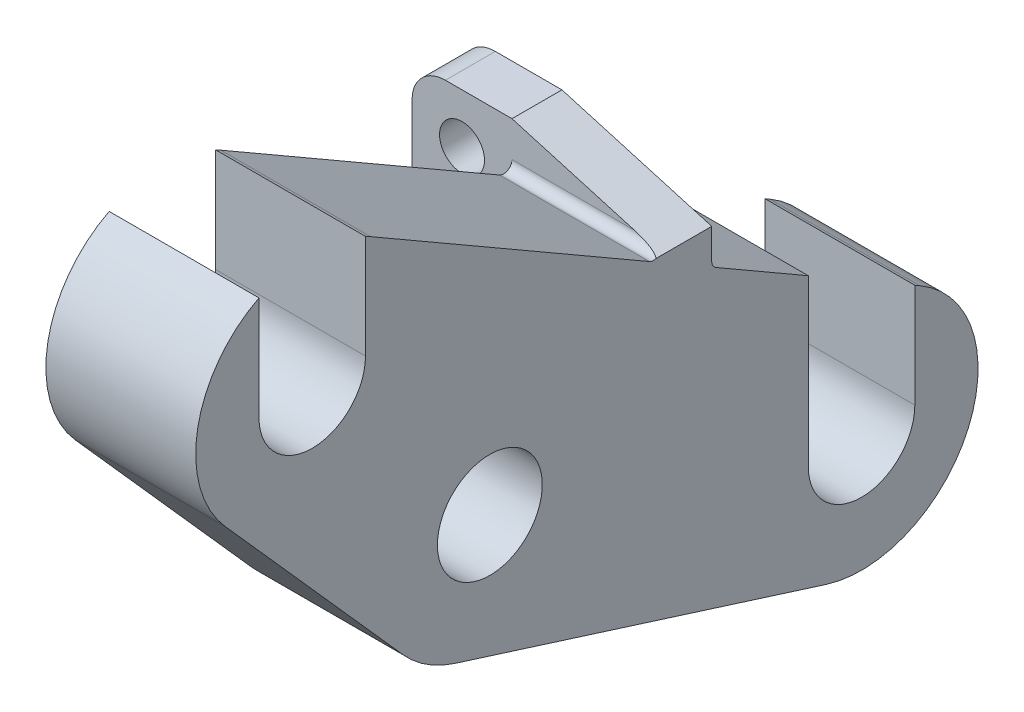
ISO-10303-21;
HEADER;
FILE_DESCRIPTION(('STEP AP214'),'2;1');
FILE_NAME('part.step','',(''),(''),'','','');
FILE_SCHEMA(('AUTOMOTIVE_DESIGN { 1 0 10303 214 1 1 1 1 }'));
ENDSEC;
DATA;
#1=APPLICATION_CONTEXT('core data for automotive mechanical design processes');
#2=APPLICATION_PROTOCOL_DEFINITION('international standard','automotive_design',2000,#1);
#3=PRODUCT_CONTEXT('',#1,'mechanical');
#4=PRODUCT('Part','Part','',(#3));
#5=PRODUCT_RELATED_PRODUCT_CATEGORY('part','',(#4));
#6=PRODUCT_DEFINITION_FORMATION('','',#4);
#7=PRODUCT_DEFINITION_CONTEXT('part definition',#1,'design');
#8=PRODUCT_DEFINITION('design','',#6,#7);
#9=PRODUCT_DEFINITION_SHAPE('','',#8);
#10=(LENGTH_UNIT() NAMED_UNIT(*) SI_UNIT(.MILLI.,.METRE.));
#11=(NAMED_UNIT(*) PLANE_ANGLE_UNIT() SI_UNIT($,.RADIAN.));
#12=(NAMED_UNIT(*) SI_UNIT($,.STERADIAN.) SOLID_ANGLE_UNIT());
#13=UNCERTAINTY_MEASURE_WITH_UNIT(LENGTH_MEASURE(1.E-05),#10,'distance_accuracy_value','');
#14=(GEOMETRIC_REPRESENTATION_CONTEXT(3) GLOBAL_UNCERTAINTY_ASSIGNED_CONTEXT((#13)) GLOBAL_UNIT_ASSIGNED_CONTEXT((#10,
#11,#12)) REPRESENTATION_CONTEXT('',''));
#15=CARTESIAN_POINT('',(0.,0.,0.));
#16=DIRECTION('',(0.,0.,1.));
#17=DIRECTION('',(1.,0.,0.));
#18=AXIS2_PLACEMENT_3D('',#15,#16,#17);
#19=CARTESIAN_POINT('',(0.,224.03835831168,3.17622529679652));
#20=DIRECTION('',(0.,0.866046289310642,-0.499963823462526));
#21=DIRECTION('',(0.,0.499963823462526,0.866046289310642));
#22=AXIS2_PLACEMENT_3D('',#19,#20,#21);
#23=PLANE('',#22);
#24=DIRECTION('',(0.,0.499963823462526,0.866046289310642));
#25=VECTOR('',#24,1.);
#26=CARTESIAN_POINT('',(0.,224.03835831168,3.17622529679652));
#27=LINE('',#26,#25);
#28=CARTESIAN_POINT('',(0.,224.03835831168,3.17622529679652));
#29=VERTEX_POINT('',#28);
#30=CARTESIAN_POINT('',(0.,226.809372265831,7.97622529679651));
#31=VERTEX_POINT('',#30);
#32=EDGE_CURVE('E293',#29,#31,#27,.T.);
#33=ORIENTED_EDGE('',*,*,#32,.T.);
#34=CARTESIAN_POINT('',(-1.,226.809372265831,7.97622529679651));
#35=DIRECTION('',(0.,0.866046289310642,-0.499963823462526));
#36=DIRECTION('',(0.,0.499963823462526,0.866046289310642));
#37=AXIS2_PLACEMENT_3D('',#34,#35,#36);
#38=ELLIPSE('',#37,1.15467269168255,1.);
#39=CARTESIAN_POINT('',(-0.338541662630282,227.242332753908,8.72620720852778));
#40=VERTEX_POINT('',#39);
#41=EDGE_CURVE('E47',#31,#40,#38,.F.);
#42=ORIENTED_EDGE('',*,*,#41,.T.);
#43=DIRECTION('',(-1.,0.,0.));
#44=VECTOR('',#43,1.);
#45=CARTESIAN_POINT('',(9.,227.242332753908,8.72620720852778));
#46=LINE('',#45,#44);
#47=CARTESIAN_POINT('',(9.,227.242332753908,8.72620720852778));
#48=VERTEX_POINT('',#47);
#49=EDGE_CURVE('E52',#40,#48,#46,.F.);
#50=ORIENTED_EDGE('',*,*,#49,.T.);
#51=DIRECTION('',(0.,0.499963823462526,0.866046289310642));
#52=VECTOR('',#51,1.);
#53=CARTESIAN_POINT('',(9.,224.03835831168,3.17622529679652));
#54=LINE('',#53,#52);
#55=CARTESIAN_POINT('',(9.,224.03835831168,3.17622529679652));
#56=VERTEX_POINT('',#55);
#57=EDGE_CURVE('E391',#56,#48,#54,.T.);
#58=ORIENTED_EDGE('',*,*,#57,.F.);
#59=DIRECTION('',(1.,0.,0.));
#60=VECTOR('',#59,1.);
#61=CARTESIAN_POINT('',(0.,224.03835831168,3.17622529679652));
#62=LINE('',#61,#60);
#63=EDGE_CURVE('E405',#29,#56,#62,.T.);
#64=ORIENTED_EDGE('',*,*,#63,.F.);
#65=EDGE_LOOP('',(#33,#42,#50,#58,#64));
#66=FACE_BOUND('',#65,.T.);
#67=ADVANCED_FACE('F33',(#66),#23,.T.);
#68=CARTESIAN_POINT('',(0.,233.159487205837,32.9770211422335));
#69=DIRECTION('',(-1.,0.,0.));
#70=DIRECTION('',(0.,0.,1.));
#71=AXIS2_PLACEMENT_3D('',#68,#69,#70);
#72=PLANE('',#71);
#73=DIRECTION('',(0.,-0.301112278504257,-0.953588693165966));
#74=VECTOR('',#73,1.);
#75=CARTESIAN_POINT('',(0.,214.484366353677,24.4143058116893));
#76=LINE('',#75,#74);
#77=CARTESIAN_POINT('',(0.,209.293755439823,7.97622529679651));
#78=VERTEX_POINT('',#77);
#79=CARTESIAN_POINT('',(0.,207.433185981641,2.0840112463263));
#80=VERTEX_POINT('',#79);
#81=EDGE_CURVE('E236',#78,#80,#76,.T.);
#82=ORIENTED_EDGE('',*,*,#81,.F.);
#83=DIRECTION('',(0.,-1.,0.));
#84=VECTOR('',#83,1.);
#85=CARTESIAN_POINT('',(0.,227.675355898563,7.97622529679651));
#86=LINE('',#85,#84);
#87=EDGE_CURVE('E284',#78,#31,#86,.F.);
#88=ORIENTED_EDGE('',*,*,#87,.T.);
#89=ORIENTED_EDGE('',*,*,#32,.F.);
#90=DIRECTION('',(0.,1.,0.));
#91=VECTOR('',#90,1.);
#92=CARTESIAN_POINT('',(0.,214.108306833803,3.17622529679652));
#93=LINE('',#92,#91);
#94=CARTESIAN_POINT('',(0.,214.108306833803,3.17622529679652));
#95=VERTEX_POINT('',#94);
#96=EDGE_CURVE('E347',#95,#29,#93,.T.);
#97=ORIENTED_EDGE('',*,*,#96,.F.);
#98=CARTESIAN_POINT('',(0.,214.108306833803,-0.023774703203491));
#99=DIRECTION('',(-1.,0.,0.));
#100=DIRECTION('',(0.,0.,1.));
#101=AXIS2_PLACEMENT_3D('',#98,#99,#100);
#102=CIRCLE('',#101,3.20000000000001);
#103=CARTESIAN_POINT('',(0.,214.108306833803,-3.2237747032035));
#104=VERTEX_POINT('',#103);
#105=EDGE_CURVE('E344',#104,#95,#102,.T.);
#106=ORIENTED_EDGE('',*,*,#105,.F.);
#107=DIRECTION('',(0.,-1.,0.));
#108=VECTOR('',#107,1.);
#109=CARTESIAN_POINT('',(0.,214.108306833803,-3.2237747032035));
#110=LINE('',#109,#108);
#111=CARTESIAN_POINT('',(0.,220.34367303948,-3.2237747032035));
#112=VERTEX_POINT('',#111);
#113=EDGE_CURVE('E341',#112,#104,#110,.T.);
#114=ORIENTED_EDGE('',*,*,#113,.F.);
#115=DIRECTION('',(0.,0.499963823462515,0.866046289310648));
#116=VECTOR('',#115,1.);
#117=CARTESIAN_POINT('',(0.,220.170630858978,-3.52352146744079));
#118=LINE('',#117,#116);
#119=CARTESIAN_POINT('',(0.,220.170630858978,-3.52352146744079));
#120=VERTEX_POINT('',#119);
#121=EDGE_CURVE('E338',#120,#112,#118,.T.);
#122=ORIENTED_EDGE('',*,*,#121,.F.);
#123=CARTESIAN_POINT('',(0.,214.108306833803,-0.023774703203491));
#124=DIRECTION('',(1.,0.,0.));
#125=DIRECTION('',(0.,0.,-1.));
#126=AXIS2_PLACEMENT_3D('',#123,#124,#125);
#127=CIRCLE('',#126,7.);
#128=EDGE_CURVE('E235',#80,#120,#127,.T.);
#129=ORIENTED_EDGE('',*,*,#128,.F.);
#130=EDGE_LOOP('',(#82,#88,#89,#97,#106,#114,#122,#129));
#131=FACE_BOUND('',#130,.T.);
#132=ADVANCED_FACE('F456',(#131),#72,.T.);
#133=CARTESIAN_POINT('',(0.,233.159487205837,32.9770211422335));
#134=DIRECTION('',(1.,0.,0.));
#135=DIRECTION('',(0.,0.,-1.));
#136=AXIS2_PLACEMENT_3D('',#133,#134,#135);
#137=CYLINDRICAL_SURFACE('',#136,3.20000000000002);
#138=CARTESIAN_POINT('',(9.,233.159487205837,32.9770211422335));
#139=DIRECTION('',(-1.,0.,0.));
#140=DIRECTION('',(0.,0.,1.));
#141=AXIS2_PLACEMENT_3D('',#138,#139,#140);
#142=CIRCLE('',#141,3.20000000000002);
#143=CARTESIAN_POINT('',(9.,233.159487205837,29.7770211422334));
#144=VERTEX_POINT('',#143);
#145=CARTESIAN_POINT('',(9.,233.159487205837,36.1770211422335));
#146=VERTEX_POINT('',#145);
#147=EDGE_CURVE('E318',#144,#146,#142,.T.);
#148=ORIENTED_EDGE('',*,*,#147,.F.);
#149=DIRECTION('',(1.,0.,0.));
#150=VECTOR('',#149,1.);
#151=CARTESIAN_POINT('',(0.,233.159487205837,29.7770211422334));
#152=LINE('',#151,#150);
#153=CARTESIAN_POINT('',(0.,233.159487205837,29.7770211422334));
#154=VERTEX_POINT('',#153);
#155=EDGE_CURVE('E398',#154,#144,#152,.T.);
#156=ORIENTED_EDGE('',*,*,#155,.F.);
#157=CARTESIAN_POINT('',(0.,233.159487205837,32.9770211422335));
#158=DIRECTION('',(-1.,0.,0.));
#159=DIRECTION('',(0.,0.,1.));
#160=AXIS2_PLACEMENT_3D('',#157,#158,#159);
#161=CIRCLE('',#160,3.20000000000002);
#162=CARTESIAN_POINT('',(0.,233.159487205837,36.1770211422335));
#163=VERTEX_POINT('',#162);
#164=EDGE_CURVE('E321',#154,#163,#161,.T.);
#165=ORIENTED_EDGE('',*,*,#164,.T.);
#166=DIRECTION('',(1.,0.,0.));
#167=VECTOR('',#166,1.);
#168=CARTESIAN_POINT('',(0.,233.159487205837,36.1770211422335));
#169=LINE('',#168,#167);
#170=EDGE_CURVE('E358',#163,#146,#169,.T.);
#171=ORIENTED_EDGE('',*,*,#170,.T.);
#172=EDGE_LOOP('',(#148,#156,#165,#171));
#173=FACE_BOUND('',#172,.T.);
#174=ADVANCED_FACE('F462',(#173),#137,.F.);
#175=CARTESIAN_POINT('',(0.,233.159487205837,29.7770211422334));
#176=DIRECTION('',(0.,0.,1.));
#177=DIRECTION('',(0.,-1.,0.));
#178=AXIS2_PLACEMENT_3D('',#175,#176,#177);
#179=PLANE('',#178);
#180=DIRECTION('',(0.,-1.,0.));
#181=VECTOR('',#180,1.);
#182=CARTESIAN_POINT('',(9.,233.159487205837,29.7770211422334));
#183=LINE('',#182,#181);
#184=CARTESIAN_POINT('',(9.,239.385240172347,29.7770211422333));
#185=VERTEX_POINT('',#184);
#186=EDGE_CURVE('E325',#185,#144,#183,.T.);
#187=ORIENTED_EDGE('',*,*,#186,.F.);
#188=DIRECTION('',(1.,0.,0.));
#189=VECTOR('',#188,1.);
#190=CARTESIAN_POINT('',(0.,239.385240172347,29.7770211422333));
#191=LINE('',#190,#189);
#192=CARTESIAN_POINT('',(0.,239.385240172347,29.7770211422333));
#193=VERTEX_POINT('',#192);
#194=EDGE_CURVE('E400',#193,#185,#191,.T.);
#195=ORIENTED_EDGE('',*,*,#194,.F.);
#196=DIRECTION('',(0.,-1.,0.));
#197=VECTOR('',#196,1.);
#198=CARTESIAN_POINT('',(0.,233.159487205837,29.7770211422334));
#199=LINE('',#198,#197);
#200=EDGE_CURVE('E355',#193,#154,#199,.T.);
#201=ORIENTED_EDGE('',*,*,#200,.T.);
#202=ORIENTED_EDGE('',*,*,#155,.T.);
#203=EDGE_LOOP('',(#187,#195,#201,#202));
#204=FACE_BOUND('',#203,.T.);
#205=ADVANCED_FACE('F477',(#204),#179,.T.);
#206=CARTESIAN_POINT('',(0.,233.159487205837,32.9770211422335));
#207=DIRECTION('',(1.,0.,0.));
#208=DIRECTION('',(0.,0.,-1.));
#209=AXIS2_PLACEMENT_3D('',#206,#207,#208);
#210=CYLINDRICAL_SURFACE('',#209,7.00000000000139);
#211=CARTESIAN_POINT('',(9.,233.159487205837,32.9770211422335));
#212=DIRECTION('',(1.,0.,0.));
#213=DIRECTION('',(0.,0.,-1.));
#214=AXIS2_PLACEMENT_3D('',#211,#212,#213);
#215=CIRCLE('',#214,7.00000000000139);
#216=CARTESIAN_POINT('',(9.,239.221811231013,29.4772743779952));
#217=VERTEX_POINT('',#216);
#218=EDGE_CURVE('E393',#217,#185,#215,.T.);
#219=ORIENTED_EDGE('',*,*,#218,.F.);
#220=DIRECTION('',(1.,0.,0.));
#221=VECTOR('',#220,1.);
#222=CARTESIAN_POINT('',(0.,239.221811231013,29.4772743779952));
#223=LINE('',#222,#221);
#224=CARTESIAN_POINT('',(0.,239.221811231013,29.4772743779952));
#225=VERTEX_POINT('',#224);
#226=EDGE_CURVE('E402',#225,#217,#223,.T.);
#227=ORIENTED_EDGE('',*,*,#226,.F.);
#228=CARTESIAN_POINT('',(0.,233.159487205837,32.9770211422335));
#229=DIRECTION('',(1.,0.,0.));
#230=DIRECTION('',(0.,0.,-1.));
#231=AXIS2_PLACEMENT_3D('',#228,#229,#230);
#232=CIRCLE('',#231,7.00000000000139);
#233=EDGE_CURVE('E352',#225,#193,#232,.T.);
#234=ORIENTED_EDGE('',*,*,#233,.T.);
#235=ORIENTED_EDGE('',*,*,#194,.T.);
#236=EDGE_LOOP('',(#219,#227,#234,#235));
#237=FACE_BOUND('',#236,.T.);
#238=ADVANCED_FACE('F469',(#237),#210,.T.);
#239=CARTESIAN_POINT('',(9.,229.551511049033,12.7262072085278));
#240=VERTEX_POINT('',#239);
#241=EDGE_CURVE('E390',#240,#217,#54,.T.);
#242=ORIENTED_EDGE('',*,*,#241,.F.);
#243=DIRECTION('',(1.,0.,0.));
#244=VECTOR('',#243,1.);
#245=CARTESIAN_POINT('',(0.,229.551511049033,12.7262072085278));
#246=LINE('',#245,#244);
#247=CARTESIAN_POINT('',(0.,229.551511049033,12.7262072085278));
#248=VERTEX_POINT('',#247);
#249=EDGE_CURVE('E273',#240,#248,#246,.F.);
#250=ORIENTED_EDGE('',*,*,#249,.T.);
#251=EDGE_CURVE('E350',#248,#225,#27,.T.);
#252=ORIENTED_EDGE('',*,*,#251,.T.);
#253=ORIENTED_EDGE('',*,*,#226,.T.);
#254=EDGE_LOOP('',(#242,#250,#252,#253));
#255=FACE_BOUND('',#254,.T.);
#256=ADVANCED_FACE('F458',(#255),#23,.T.);
#257=CARTESIAN_POINT('',(0.,214.108306833803,3.17622529679652));
#258=DIRECTION('',(0.,0.,-1.));
#259=DIRECTION('',(-1.,0.,0.));
#260=AXIS2_PLACEMENT_3D('',#257,#258,#259);
#261=PLANE('',#260);
#262=DIRECTION('',(0.,1.,0.));
#263=VECTOR('',#262,1.);
#264=CARTESIAN_POINT('',(9.,214.108306833803,3.17622529679652));
#265=LINE('',#264,#263);
#266=CARTESIAN_POINT('',(9.,214.108306833803,3.17622529679652));
#267=VERTEX_POINT('',#266);
#268=EDGE_CURVE('E387',#267,#56,#265,.T.);
#269=ORIENTED_EDGE('',*,*,#268,.F.);
#270=DIRECTION('',(1.,0.,0.));
#271=VECTOR('',#270,1.);
#272=CARTESIAN_POINT('',(0.,214.108306833803,3.17622529679652));
#273=LINE('',#272,#271);
#274=EDGE_CURVE('E407',#95,#267,#273,.T.);
#275=ORIENTED_EDGE('',*,*,#274,.F.);
#276=ORIENTED_EDGE('',*,*,#96,.T.);
#277=ORIENTED_EDGE('',*,*,#63,.T.);
#278=EDGE_LOOP('',(#269,#275,#276,#277));
#279=FACE_BOUND('',#278,.T.);
#280=ADVANCED_FACE('F468',(#279),#261,.T.);
#281=CARTESIAN_POINT('',(0.,214.108306833803,-0.023774703203491));
#282=DIRECTION('',(1.,0.,0.));
#283=DIRECTION('',(0.,0.,-1.));
#284=AXIS2_PLACEMENT_3D('',#281,#282,#283);
#285=CYLINDRICAL_SURFACE('',#284,3.20000000000001);
#286=CARTESIAN_POINT('',(9.,214.108306833803,-0.023774703203491));
#287=DIRECTION('',(-1.,0.,0.));
#288=DIRECTION('',(0.,0.,1.));
#289=AXIS2_PLACEMENT_3D('',#286,#287,#288);
#290=CIRCLE('',#289,3.20000000000001);
#291=CARTESIAN_POINT('',(9.,214.108306833803,-3.2237747032035));
#292=VERTEX_POINT('',#291);
#293=EDGE_CURVE('E384',#292,#267,#290,.T.);
#294=ORIENTED_EDGE('',*,*,#293,.F.);
#295=DIRECTION('',(1.,0.,0.));
#296=VECTOR('',#295,1.);
#297=CARTESIAN_POINT('',(0.,214.108306833803,-3.2237747032035));
#298=LINE('',#297,#296);
#299=EDGE_CURVE('E409',#104,#292,#298,.T.);
#300=ORIENTED_EDGE('',*,*,#299,.F.);
#301=ORIENTED_EDGE('',*,*,#105,.T.);
#302=ORIENTED_EDGE('',*,*,#274,.T.);
#303=EDGE_LOOP('',(#294,#300,#301,#302));
#304=FACE_BOUND('',#303,.T.);
#305=ADVANCED_FACE('F475',(#304),#285,.F.);
#306=CARTESIAN_POINT('',(0.,214.108306833803,-3.2237747032035));
#307=DIRECTION('',(0.,0.,1.));
#308=DIRECTION('',(0.,-1.,0.));
#309=AXIS2_PLACEMENT_3D('',#306,#307,#308);
#310=PLANE('',#309);
#311=DIRECTION('',(0.,-1.,0.));
#312=VECTOR('',#311,1.);
#313=CARTESIAN_POINT('',(9.,214.108306833803,-3.2237747032035));
#314=LINE('',#313,#312);
#315=CARTESIAN_POINT('',(9.,220.34367303948,-3.2237747032035));
#316=VERTEX_POINT('',#315);
#317=EDGE_CURVE('E381',#316,#292,#314,.T.);
#318=ORIENTED_EDGE('',*,*,#317,.F.);
#319=DIRECTION('',(1.,0.,0.));
#320=VECTOR('',#319,1.);
#321=CARTESIAN_POINT('',(0.,220.34367303948,-3.2237747032035));
#322=LINE('',#321,#320);
#323=EDGE_CURVE('E411',#112,#316,#322,.T.);
#324=ORIENTED_EDGE('',*,*,#323,.F.);
#325=ORIENTED_EDGE('',*,*,#113,.T.);
#326=ORIENTED_EDGE('',*,*,#299,.T.);
#327=EDGE_LOOP('',(#318,#324,#325,#326));
#328=FACE_BOUND('',#327,.T.);
#329=ADVANCED_FACE('F686',(#328),#310,.T.);
#330=CARTESIAN_POINT('',(0.,220.170630858978,-3.52352146744079));
#331=DIRECTION('',(0.,0.866046289310648,-0.499963823462515));
#332=DIRECTION('',(0.,0.499963823462515,0.866046289310648));
#333=AXIS2_PLACEMENT_3D('',#330,#331,#332);
#334=PLANE('',#333);
#335=DIRECTION('',(0.,0.499963823462515,0.866046289310648));
#336=VECTOR('',#335,1.);
#337=CARTESIAN_POINT('',(9.,220.170630858978,-3.52352146744079));
#338=LINE('',#337,#336);
#339=CARTESIAN_POINT('',(9.,220.170630858978,-3.52352146744079));
#340=VERTEX_POINT('',#339);
#341=EDGE_CURVE('E378',#340,#316,#338,.T.);
#342=ORIENTED_EDGE('',*,*,#341,.F.);
#343=DIRECTION('',(1.,0.,0.));
#344=VECTOR('',#343,1.);
#345=CARTESIAN_POINT('',(0.,220.170630858978,-3.52352146744079));
#346=LINE('',#345,#344);
#347=EDGE_CURVE('E413',#120,#340,#346,.T.);
#348=ORIENTED_EDGE('',*,*,#347,.F.);
#349=ORIENTED_EDGE('',*,*,#121,.T.);
#350=ORIENTED_EDGE('',*,*,#323,.T.);
#351=EDGE_LOOP('',(#342,#348,#349,#350));
#352=FACE_BOUND('',#351,.T.);
#353=ADVANCED_FACE('F676',(#352),#334,.T.);
#354=CARTESIAN_POINT('',(0.,214.108306833803,-0.023774703203491));
#355=DIRECTION('',(1.,0.,0.));
#356=DIRECTION('',(0.,0.,-1.));
#357=AXIS2_PLACEMENT_3D('',#354,#355,#356);
#358=CYLINDRICAL_SURFACE('',#357,7.);
#359=CARTESIAN_POINT('',(9.,214.108306833803,-0.023774703203491));
#360=DIRECTION('',(1.,0.,0.));
#361=DIRECTION('',(0.,0.,-1.));
#362=AXIS2_PLACEMENT_3D('',#359,#360,#361);
#363=CIRCLE('',#362,7.);
#364=CARTESIAN_POINT('',(9.,207.433185981641,2.0840112463263));
#365=VERTEX_POINT('',#364);
#366=EDGE_CURVE('E375',#365,#340,#363,.T.);
#367=ORIENTED_EDGE('',*,*,#366,.F.);
#368=DIRECTION('',(1.,0.,0.));
#369=VECTOR('',#368,1.);
#370=CARTESIAN_POINT('',(0.,207.433185981641,2.0840112463263));
#371=LINE('',#370,#369);
#372=EDGE_CURVE('E415',#80,#365,#371,.T.);
#373=ORIENTED_EDGE('',*,*,#372,.F.);
#374=ORIENTED_EDGE('',*,*,#128,.T.);
#375=ORIENTED_EDGE('',*,*,#347,.T.);
#376=EDGE_LOOP('',(#367,#373,#374,#375));
#377=FACE_BOUND('',#376,.T.);
#378=ADVANCED_FACE('F544',(#377),#358,.T.);
#379=CARTESIAN_POINT('',(0.,214.484366353677,24.4143058116893));
#380=DIRECTION('',(0.,-0.953588693165966,0.301112278504257));
#381=DIRECTION('',(0.,-0.301112278504257,-0.953588693165966));
#382=AXIS2_PLACEMENT_3D('',#379,#380,#381);
#383=PLANE('',#382);
#384=CARTESIAN_POINT('',(0.,214.484366353677,24.4143058116893));
#385=VERTEX_POINT('',#384);
#386=CARTESIAN_POINT('',(0.,210.556825275538,11.9762252967965));
#387=VERTEX_POINT('',#386);
#388=EDGE_CURVE('E221',#385,#387,#76,.T.);
#389=ORIENTED_EDGE('',*,*,#388,.T.);
#390=DIRECTION('',(0.,-0.301112278504257,-0.953588693165966));
#391=VECTOR('',#390,1.);
#392=CARTESIAN_POINT('',(0.,214.484366353677,24.4143058116893));
#393=LINE('',#392,#391);
#394=EDGE_CURVE('E212',#387,#78,#393,.T.);
#395=ORIENTED_EDGE('',*,*,#394,.T.);
#396=ORIENTED_EDGE('',*,*,#81,.T.);
#397=ORIENTED_EDGE('',*,*,#372,.T.);
#398=DIRECTION('',(0.,-0.301112278504257,-0.953588693165966));
#399=VECTOR('',#398,1.);
#400=CARTESIAN_POINT('',(9.,214.484366353677,24.4143058116893));
#401=LINE('',#400,#399);
#402=CARTESIAN_POINT('',(9.,214.484366353677,24.4143058116893));
#403=VERTEX_POINT('',#402);
#404=EDGE_CURVE('E373',#403,#365,#401,.T.);
#405=ORIENTED_EDGE('',*,*,#404,.F.);
#406=DIRECTION('',(1.,0.,0.));
#407=VECTOR('',#406,1.);
#408=CARTESIAN_POINT('',(0.,214.484366353677,24.4143058116893));
#409=LINE('',#408,#407);
#410=EDGE_CURVE('E234',#385,#403,#409,.T.);
#411=ORIENTED_EDGE('',*,*,#410,.F.);
#412=EDGE_LOOP('',(#389,#395,#396,#397,#405,#411));
#413=FACE_BOUND('',#412,.T.);
#414=ADVANCED_FACE('F231',(#413),#383,.T.);
#415=CARTESIAN_POINT('',(0.,221.159487205839,22.3065198621595));
#416=DIRECTION('',(1.,0.,0.));
#417=DIRECTION('',(0.,0.,-1.));
#418=AXIS2_PLACEMENT_3D('',#415,#416,#417);
#419=CYLINDRICAL_SURFACE('',#418,6.99999999999999);
#420=CARTESIAN_POINT('',(9.,221.159487205839,22.3065198621595));
#421=DIRECTION('',(1.,0.,0.));
#422=DIRECTION('',(0.,0.,-1.));
#423=AXIS2_PLACEMENT_3D('',#420,#421,#422);
#424=CIRCLE('',#423,6.99999999999999);
#425=CARTESIAN_POINT('',(9.,216.508006627188,27.5375549821361));
#426=VERTEX_POINT('',#425);
#427=EDGE_CURVE('E370',#426,#403,#424,.T.);
#428=ORIENTED_EDGE('',*,*,#427,.F.);
#429=DIRECTION('',(1.,0.,0.));
#430=VECTOR('',#429,1.);
#431=CARTESIAN_POINT('',(0.,216.508006627188,27.5375549821361));
#432=LINE('',#431,#430);
#433=CARTESIAN_POINT('',(0.,216.508006627188,27.5375549821361));
#434=VERTEX_POINT('',#433);
#435=EDGE_CURVE('E419',#434,#426,#432,.T.);
#436=ORIENTED_EDGE('',*,*,#435,.F.);
#437=CARTESIAN_POINT('',(0.,221.159487205839,22.3065198621595));
#438=DIRECTION('',(1.,0.,0.));
#439=DIRECTION('',(0.,0.,-1.));
#440=AXIS2_PLACEMENT_3D('',#437,#438,#439);
#441=CIRCLE('',#440,6.99999999999999);
#442=EDGE_CURVE('E334',#434,#385,#441,.T.);
#443=ORIENTED_EDGE('',*,*,#442,.T.);
#444=ORIENTED_EDGE('',*,*,#410,.T.);
#445=EDGE_LOOP('',(#428,#436,#443,#444));
#446=FACE_BOUND('',#445,.T.);
#447=ADVANCED_FACE('F543',(#446),#419,.T.);
#448=CARTESIAN_POINT('',(0.,228.508006627188,38.2080562622089));
#449=DIRECTION('',(0.,-0.664497225521628,0.747290731425232));
#450=DIRECTION('',(0.,-0.747290731425233,-0.664497225521628));
#451=AXIS2_PLACEMENT_3D('',#448,#449,#450);
#452=PLANE('',#451);
#453=DIRECTION('',(0.,-0.747290731425232,-0.664497225521628));
#454=VECTOR('',#453,1.);
#455=CARTESIAN_POINT('',(9.,228.508006627188,38.2080562622089));
#456=LINE('',#455,#454);
#457=CARTESIAN_POINT('',(9.,228.508006627188,38.2080562622089));
#458=VERTEX_POINT('',#457);
#459=EDGE_CURVE('E367',#458,#426,#456,.T.);
#460=ORIENTED_EDGE('',*,*,#459,.F.);
#461=DIRECTION('',(1.,0.,0.));
#462=VECTOR('',#461,1.);
#463=CARTESIAN_POINT('',(0.,228.508006627188,38.2080562622089));
#464=LINE('',#463,#462);
#465=CARTESIAN_POINT('',(0.,228.508006627188,38.2080562622089));
#466=VERTEX_POINT('',#465);
#467=EDGE_CURVE('E421',#466,#458,#464,.T.);
#468=ORIENTED_EDGE('',*,*,#467,.F.);
#469=DIRECTION('',(0.,-0.747290731425232,-0.664497225521628));
#470=VECTOR('',#469,1.);
#471=CARTESIAN_POINT('',(0.,228.508006627188,38.2080562622089));
#472=LINE('',#471,#470);
#473=EDGE_CURVE('E331',#466,#434,#472,.T.);
#474=ORIENTED_EDGE('',*,*,#473,.T.);
#475=ORIENTED_EDGE('',*,*,#435,.T.);
#476=EDGE_LOOP('',(#460,#468,#474,#475));
#477=FACE_BOUND('',#476,.T.);
#478=ADVANCED_FACE('F650',(#477),#452,.T.);
#479=CARTESIAN_POINT('',(0.,233.159487205837,32.9770211422335));
#480=DIRECTION('',(1.,0.,0.));
#481=DIRECTION('',(0.,0.,-1.));
#482=AXIS2_PLACEMENT_3D('',#479,#480,#481);
#483=CYLINDRICAL_SURFACE('',#482,6.99999999999903);
#484=CARTESIAN_POINT('',(9.,233.159487205837,32.9770211422335));
#485=DIRECTION('',(1.,0.,0.));
#486=DIRECTION('',(0.,0.,-1.));
#487=AXIS2_PLACEMENT_3D('',#484,#485,#486);
#488=CIRCLE('',#487,6.99999999999903);
#489=CARTESIAN_POINT('',(9.,239.385240172346,36.1770211422327));
#490=VERTEX_POINT('',#489);
#491=EDGE_CURVE('E364',#490,#458,#488,.T.);
#492=ORIENTED_EDGE('',*,*,#491,.F.);
#493=DIRECTION('',(1.,0.,0.));
#494=VECTOR('',#493,1.);
#495=CARTESIAN_POINT('',(0.,239.385240172346,36.1770211422327));
#496=LINE('',#495,#494);
#497=CARTESIAN_POINT('',(0.,239.385240172346,36.1770211422327));
#498=VERTEX_POINT('',#497);
#499=EDGE_CURVE('E423',#498,#490,#496,.T.);
#500=ORIENTED_EDGE('',*,*,#499,.F.);
#501=CARTESIAN_POINT('',(0.,233.159487205837,32.9770211422335));
#502=DIRECTION('',(1.,0.,0.));
#503=DIRECTION('',(0.,0.,-1.));
#504=AXIS2_PLACEMENT_3D('',#501,#502,#503);
#505=CIRCLE('',#504,6.99999999999903);
#506=EDGE_CURVE('E328',#498,#466,#505,.T.);
#507=ORIENTED_EDGE('',*,*,#506,.T.);
#508=ORIENTED_EDGE('',*,*,#467,.T.);
#509=EDGE_LOOP('',(#492,#500,#507,#508));
#510=FACE_BOUND('',#509,.T.);
#511=ADVANCED_FACE('F639',(#510),#483,.T.);
#512=CARTESIAN_POINT('',(0.,233.159487205837,36.1770211422335));
#513=DIRECTION('',(0.,0.,-1.));
#514=DIRECTION('',(0.,1.,0.));
#515=AXIS2_PLACEMENT_3D('',#512,#513,#514);
#516=PLANE('',#515);
#517=DIRECTION('',(0.,1.,0.));
#518=VECTOR('',#517,1.);
#519=CARTESIAN_POINT('',(9.,233.159487205837,36.1770211422335));
#520=LINE('',#519,#518);
#521=EDGE_CURVE('E361',#146,#490,#520,.T.);
#522=ORIENTED_EDGE('',*,*,#521,.F.);
#523=ORIENTED_EDGE('',*,*,#170,.F.);
#524=DIRECTION('',(0.,1.,0.));
#525=VECTOR('',#524,1.);
#526=CARTESIAN_POINT('',(0.,233.159487205837,36.1770211422335));
#527=LINE('',#526,#525);
#528=EDGE_CURVE('E324',#163,#498,#527,.T.);
#529=ORIENTED_EDGE('',*,*,#528,.T.);
#530=ORIENTED_EDGE('',*,*,#499,.T.);
#531=EDGE_LOOP('',(#522,#523,#529,#530));
#532=FACE_BOUND('',#531,.T.);
#533=ADVANCED_FACE('F594',(#532),#516,.T.);
#534=DIRECTION('',(0.,1.,0.));
#535=VECTOR('',#534,1.);
#536=CARTESIAN_POINT('',(0.,233.159487205837,11.9762252967965));
#537=LINE('',#536,#535);
#538=CARTESIAN_POINT('',(0.,229.984534193689,11.9762252967965));
#539=VERTEX_POINT('',#538);
#540=EDGE_CURVE('E204',#387,#539,#537,.T.);
#541=ORIENTED_EDGE('',*,*,#540,.F.);
#542=ORIENTED_EDGE('',*,*,#388,.F.);
#543=ORIENTED_EDGE('',*,*,#442,.F.);
#544=ORIENTED_EDGE('',*,*,#473,.F.);
#545=ORIENTED_EDGE('',*,*,#506,.F.);
#546=ORIENTED_EDGE('',*,*,#528,.F.);
#547=ORIENTED_EDGE('',*,*,#164,.F.);
#548=ORIENTED_EDGE('',*,*,#200,.F.);
#549=ORIENTED_EDGE('',*,*,#233,.F.);
#550=ORIENTED_EDGE('',*,*,#251,.F.);
#551=CARTESIAN_POINT('',(0.,229.984534193689,12.4762252967965));
#552=DIRECTION('',(-1.,0.,0.));
#553=DIRECTION('',(0.,0.,1.));
#554=AXIS2_PLACEMENT_3D('',#551,#552,#553);
#555=CIRCLE('',#554,0.5);
#556=EDGE_CURVE('E225',#248,#539,#555,.F.);
#557=ORIENTED_EDGE('',*,*,#556,.T.);
#558=EDGE_LOOP('',(#541,#542,#543,#544,#545,#546,#547,#548,#549,#550,#557));
#559=FACE_BOUND('',#558,.T.);
#560=CARTESIAN_POINT('',(0.,221.159487205839,22.3065198621595));
#561=DIRECTION('',(1.,0.,0.));
#562=DIRECTION('',(0.,0.,1.));
#563=AXIS2_PLACEMENT_3D('',#560,#561,#562);
#564=CIRCLE('',#563,3.14999999999905);
#565=CARTESIAN_POINT('',(0.,221.159487205839,25.4565198621585));
#566=VERTEX_POINT('',#565);
#567=EDGE_CURVE('E315',#566,#566,#564,.T.);
#568=ORIENTED_EDGE('',*,*,#567,.T.);
#569=EDGE_LOOP('',(#568));
#570=FACE_BOUND('',#569,.T.);
#571=ADVANCED_FACE('F218',(#559,#570),#72,.T.);
#572=CARTESIAN_POINT('',(9.,233.159487205837,32.9770211422335));
#573=DIRECTION('',(-1.,0.,0.));
#574=DIRECTION('',(0.,0.,1.));
#575=AXIS2_PLACEMENT_3D('',#572,#573,#574);
#576=PLANE('',#575);
#577=CARTESIAN_POINT('',(9.,221.159487205839,22.3065198621595));
#578=DIRECTION('',(1.,0.,0.));
#579=DIRECTION('',(0.,0.,1.));
#580=AXIS2_PLACEMENT_3D('',#577,#578,#579);
#581=CIRCLE('',#580,3.14999999999905);
#582=CARTESIAN_POINT('',(9.,221.159487205839,25.4565198621585));
#583=VERTEX_POINT('',#582);
#584=EDGE_CURVE('E227',#583,#583,#581,.T.);
#585=ORIENTED_EDGE('',*,*,#584,.F.);
#586=EDGE_LOOP('',(#585));
#587=FACE_BOUND('',#586,.T.);
#588=ORIENTED_EDGE('',*,*,#57,.T.);
#589=CARTESIAN_POINT('',(9.,227.675355898563,8.47622529679651));
#590=DIRECTION('',(-1.,0.,0.));
#591=DIRECTION('',(0.,0.,1.));
#592=AXIS2_PLACEMENT_3D('',#589,#590,#591);
#593=CIRCLE('',#592,0.5);
#594=CARTESIAN_POINT('',(9.,227.675355898563,8.97622529679651));
#595=VERTEX_POINT('',#594);
#596=EDGE_CURVE('E269',#48,#595,#593,.T.);
#597=ORIENTED_EDGE('',*,*,#596,.T.);
#598=DIRECTION('',(0.,1.,0.));
#599=VECTOR('',#598,1.);
#600=CARTESIAN_POINT('',(9.,232.108306833803,8.97622529679651));
#601=LINE('',#600,#599);
#602=CARTESIAN_POINT('',(9.,229.508306833803,8.97622529679651));
#603=VERTEX_POINT('',#602);
#604=EDGE_CURVE('E228',#595,#603,#601,.T.);
#605=ORIENTED_EDGE('',*,*,#604,.T.);
#606=DIRECTION('',(0.,0.,1.));
#607=VECTOR('',#606,1.);
#608=CARTESIAN_POINT('',(9.,229.508306833803,11.9762252967965));
#609=LINE('',#608,#607);
#610=CARTESIAN_POINT('',(9.,229.508306833803,12.3238852111448));
#611=VERTEX_POINT('',#610);
#612=EDGE_CURVE('E245',#603,#611,#609,.T.);
#613=ORIENTED_EDGE('',*,*,#612,.T.);
#614=CARTESIAN_POINT('',(9.,229.984534193689,12.4762252967965));
#615=DIRECTION('',(-1.,0.,0.));
#616=DIRECTION('',(0.,0.,1.));
#617=AXIS2_PLACEMENT_3D('',#614,#615,#616);
#618=CIRCLE('',#617,0.5);
#619=EDGE_CURVE('E278',#611,#240,#618,.T.);
#620=ORIENTED_EDGE('',*,*,#619,.T.);
#621=ORIENTED_EDGE('',*,*,#241,.T.);
#622=ORIENTED_EDGE('',*,*,#218,.T.);
#623=ORIENTED_EDGE('',*,*,#186,.T.);
#624=ORIENTED_EDGE('',*,*,#147,.T.);
#625=ORIENTED_EDGE('',*,*,#521,.T.);
#626=ORIENTED_EDGE('',*,*,#491,.T.);
#627=ORIENTED_EDGE('',*,*,#459,.T.);
#628=ORIENTED_EDGE('',*,*,#427,.T.);
#629=ORIENTED_EDGE('',*,*,#404,.T.);
#630=ORIENTED_EDGE('',*,*,#366,.T.);
#631=ORIENTED_EDGE('',*,*,#341,.T.);
#632=ORIENTED_EDGE('',*,*,#317,.T.);
#633=ORIENTED_EDGE('',*,*,#293,.T.);
#634=ORIENTED_EDGE('',*,*,#268,.T.);
#635=EDGE_LOOP('',(#588,#597,#605,#613,#620,#621,#622,#623,#624,#625,#626,#627,#628,#629,#630,
#631,#632,#633,#634));
#636=FACE_BOUND('',#635,.T.);
#637=ADVANCED_FACE('F451',(#587,#636),#576,.F.);
#638=CARTESIAN_POINT('',(0.,221.159487205839,22.3065198621595));
#639=DIRECTION('',(1.,0.,0.));
#640=DIRECTION('',(0.,0.,-1.));
#641=AXIS2_PLACEMENT_3D('',#638,#639,#640);
#642=CYLINDRICAL_SURFACE('',#641,3.14999999999905);
#643=ORIENTED_EDGE('',*,*,#567,.F.);
#644=EDGE_LOOP('',(#643));
#645=FACE_BOUND('',#644,.T.);
#646=ORIENTED_EDGE('',*,*,#584,.T.);
#647=EDGE_LOOP('',(#646));
#648=FACE_BOUND('',#647,.T.);
#649=ADVANCED_FACE('F443',(#645,#648),#642,.F.);
#650=CARTESIAN_POINT('',(31.6979135286953,232.108306833803,8.97622529679651));
#651=DIRECTION('',(0.,0.,-1.));
#652=DIRECTION('',(0.,1.,0.));
#653=AXIS2_PLACEMENT_3D('',#650,#651,#652);
#654=PLANE('',#653);
#655=CARTESIAN_POINT('',(-3.,229.108306833803,8.97622529679651));
#656=DIRECTION('',(0.,0.,-1.));
#657=DIRECTION('',(0.,1.,0.));
#658=AXIS2_PLACEMENT_3D('',#655,#656,#657);
#659=CIRCLE('',#658,1.34999999999999);
#660=CARTESIAN_POINT('',(-3.,230.458306833803,8.97622529679651));
#661=VERTEX_POINT('',#660);
#662=EDGE_CURVE('E429',#661,#661,#659,.T.);
#663=ORIENTED_EDGE('',*,*,#662,.F.);
#664=EDGE_LOOP('',(#663));
#665=FACE_BOUND('',#664,.T.);
#666=DIRECTION('',(-1.,0.,0.));
#667=VECTOR('',#666,1.);
#668=CARTESIAN_POINT('',(0.,227.675355898563,8.97622529679651));
#669=LINE('',#668,#667);
#670=CARTESIAN_POINT('',(-1.,227.675355898563,8.97622529679651));
#671=VERTEX_POINT('',#670);
#672=EDGE_CURVE('E266',#595,#671,#669,.T.);
#673=ORIENTED_EDGE('',*,*,#672,.T.);
#674=DIRECTION('',(0.,-1.,0.));
#675=VECTOR('',#674,1.);
#676=CARTESIAN_POINT('',(-1.,209.609522898751,8.97622529679651));
#677=LINE('',#676,#675);
#678=CARTESIAN_POINT('',(-1.,211.357306485754,8.97622529679651));
#679=VERTEX_POINT('',#678);
#680=EDGE_CURVE('E281',#671,#679,#677,.T.);
#681=ORIENTED_EDGE('',*,*,#680,.T.);
#682=DIRECTION('',(0.496613011867949,-0.867972071234694,0.));
#683=VECTOR('',#682,1.);
#684=CARTESIAN_POINT('',(-1.88053431750559,212.896289913683,8.97622529679651));
#685=LINE('',#684,#683);
#686=CARTESIAN_POINT('',(-6.,220.096224420767,8.97622529679651));
#687=VERTEX_POINT('',#686);
#688=EDGE_CURVE('E243',#679,#687,#685,.F.);
#689=ORIENTED_EDGE('',*,*,#688,.T.);
#690=DIRECTION('',(0.,-1.,0.));
#691=VECTOR('',#690,1.);
#692=CARTESIAN_POINT('',(-6.,232.108306833803,8.97622529679651));
#693=LINE('',#692,#691);
#694=CARTESIAN_POINT('',(-6.,230.108306833803,8.97622529679651));
#695=VERTEX_POINT('',#694);
#696=EDGE_CURVE('E428',#695,#687,#693,.T.);
#697=ORIENTED_EDGE('',*,*,#696,.F.);
#698=CARTESIAN_POINT('',(-4.,230.108306833803,8.97622529679651));
#699=DIRECTION('',(0.,0.,-1.));
#700=DIRECTION('',(0.,1.,0.));
#701=AXIS2_PLACEMENT_3D('',#698,#699,#700);
#702=CIRCLE('',#701,2.);
#703=CARTESIAN_POINT('',(-4.,232.108306833803,8.97622529679651));
#704=VERTEX_POINT('',#703);
#705=EDGE_CURVE('E260',#695,#704,#702,.T.);
#706=ORIENTED_EDGE('',*,*,#705,.T.);
#707=DIRECTION('',(-1.,0.,0.));
#708=VECTOR('',#707,1.);
#709=CARTESIAN_POINT('',(31.6979135286953,232.108306833803,8.97622529679651));
#710=LINE('',#709,#708);
#711=CARTESIAN_POINT('',(0.,232.108306833803,8.97622529679651));
#712=VERTEX_POINT('',#711);
#713=EDGE_CURVE('E305',#712,#704,#710,.T.);
#714=ORIENTED_EDGE('',*,*,#713,.F.);
#715=DIRECTION('',(0.960714182841144,-0.27753965282077,0.));
#716=VECTOR('',#715,1.);
#717=CARTESIAN_POINT('',(29.2562784392015,223.656493062478,8.97622529679651));
#718=LINE('',#717,#716);
#719=EDGE_CURVE('E254',#712,#603,#718,.T.);
#720=ORIENTED_EDGE('',*,*,#719,.T.);
#721=ORIENTED_EDGE('',*,*,#604,.F.);
#722=EDGE_LOOP('',(#673,#681,#689,#697,#706,#714,#720,#721));
#723=FACE_BOUND('',#722,.T.);
#724=ADVANCED_FACE('F300',(#665,#723),#654,.T.);
#725=CARTESIAN_POINT('',(31.6979135286953,232.108306833803,8.97622529679651));
#726=DIRECTION('',(0.,1.,0.));
#727=DIRECTION('',(0.,0.,1.));
#728=AXIS2_PLACEMENT_3D('',#725,#726,#727);
#729=PLANE('',#728);
#730=ORIENTED_EDGE('',*,*,#713,.T.);
#731=DIRECTION('',(0.,0.,-1.));
#732=VECTOR('',#731,1.);
#733=CARTESIAN_POINT('',(-4.,232.108306833803,8.97622529679651));
#734=LINE('',#733,#732);
#735=CARTESIAN_POINT('',(-4.,232.108306833803,11.9762252967965));
#736=VERTEX_POINT('',#735);
#737=EDGE_CURVE('E262',#704,#736,#734,.F.);
#738=ORIENTED_EDGE('',*,*,#737,.T.);
#739=DIRECTION('',(-1.,0.,0.));
#740=VECTOR('',#739,1.);
#741=CARTESIAN_POINT('',(31.6979135286953,232.108306833803,11.9762252967965));
#742=LINE('',#741,#740);
#743=CARTESIAN_POINT('',(-1.2490009027033E-13,232.108306833803,11.9762252967965));
#744=VERTEX_POINT('',#743);
#745=EDGE_CURVE('E308',#744,#736,#742,.T.);
#746=ORIENTED_EDGE('',*,*,#745,.F.);
#747=DIRECTION('',(0.,0.,-1.));
#748=VECTOR('',#747,1.);
#749=CARTESIAN_POINT('',(-1.2505514272432E-13,232.108306833803,8.97622529679651));
#750=LINE('',#749,#748);
#751=EDGE_CURVE('E252',#744,#712,#750,.T.);
#752=ORIENTED_EDGE('',*,*,#751,.T.);
#753=EDGE_LOOP('',(#730,#738,#746,#752));
#754=FACE_BOUND('',#753,.T.);
#755=ADVANCED_FACE('F442',(#754),#729,.T.);
#756=CARTESIAN_POINT('',(31.6979135286953,232.108306833803,11.9762252967965));
#757=DIRECTION('',(0.,0.,1.));
#758=DIRECTION('',(0.,-1.,0.));
#759=AXIS2_PLACEMENT_3D('',#756,#757,#758);
#760=PLANE('',#759);
#761=CARTESIAN_POINT('',(-3.,229.108306833803,11.9762252967965));
#762=DIRECTION('',(0.,0.,1.));
#763=DIRECTION('',(0.,-1.,0.));
#764=AXIS2_PLACEMENT_3D('',#761,#762,#763);
#765=CIRCLE('',#764,1.34999999999999);
#766=CARTESIAN_POINT('',(-3.,227.758306833803,11.9762252967965));
#767=VERTEX_POINT('',#766);
#768=EDGE_CURVE('E426',#767,#767,#765,.T.);
#769=ORIENTED_EDGE('',*,*,#768,.F.);
#770=EDGE_LOOP('',(#769));
#771=FACE_BOUND('',#770,.T.);
#772=ORIENTED_EDGE('',*,*,#540,.T.);
#773=DIRECTION('',(1.,0.,0.));
#774=VECTOR('',#773,1.);
#775=CARTESIAN_POINT('',(9.,229.984534193689,11.9762252967965));
#776=LINE('',#775,#774);
#777=CARTESIAN_POINT('',(7.35152067731882,229.984534193689,11.9762252967965));
#778=VERTEX_POINT('',#777);
#779=EDGE_CURVE('E271',#539,#778,#776,.T.);
#780=ORIENTED_EDGE('',*,*,#779,.T.);
#781=DIRECTION('',(-0.960714182841144,0.27753965282077,0.));
#782=VECTOR('',#781,1.);
#783=CARTESIAN_POINT('',(29.2562784392015,223.656493062478,11.9762252967965));
#784=LINE('',#783,#782);
#785=EDGE_CURVE('E250',#778,#744,#784,.T.);
#786=ORIENTED_EDGE('',*,*,#785,.T.);
#787=ORIENTED_EDGE('',*,*,#745,.T.);
#788=CARTESIAN_POINT('',(-4.,230.108306833803,11.9762252967965));
#789=DIRECTION('',(0.,0.,1.));
#790=DIRECTION('',(0.,-1.,0.));
#791=AXIS2_PLACEMENT_3D('',#788,#789,#790);
#792=CIRCLE('',#791,2.);
#793=CARTESIAN_POINT('',(-6.,230.108306833803,11.9762252967965));
#794=VERTEX_POINT('',#793);
#795=EDGE_CURVE('E264',#736,#794,#792,.T.);
#796=ORIENTED_EDGE('',*,*,#795,.T.);
#797=DIRECTION('',(0.,1.,0.));
#798=VECTOR('',#797,1.);
#799=CARTESIAN_POINT('',(-6.,232.108306833803,11.9762252967965));
#800=LINE('',#799,#798);
#801=CARTESIAN_POINT('',(-6.,221.043526797553,11.9762252967965));
#802=VERTEX_POINT('',#801);
#803=EDGE_CURVE('E207',#802,#794,#800,.T.);
#804=ORIENTED_EDGE('',*,*,#803,.F.);
#805=DIRECTION('',(-0.496613011867949,0.867972071234694,0.));
#806=VECTOR('',#805,1.);
#807=CARTESIAN_POINT('',(-1.4722032045195,213.12991787313,11.9762252967965));
#808=LINE('',#807,#806);
#809=EDGE_CURVE('E200',#802,#387,#808,.F.);
#810=ORIENTED_EDGE('',*,*,#809,.T.);
#811=EDGE_LOOP('',(#772,#780,#786,#787,#796,#804,#810));
#812=FACE_BOUND('',#811,.T.);
#813=ADVANCED_FACE('F202',(#771,#812),#760,.T.);
#814=CARTESIAN_POINT('',(-6.,232.108306833803,8.97622529679651));
#815=DIRECTION('',(-1.,0.,0.));
#816=DIRECTION('',(0.,0.,1.));
#817=AXIS2_PLACEMENT_3D('',#814,#815,#816);
#818=PLANE('',#817);
#819=ORIENTED_EDGE('',*,*,#803,.T.);
#820=DIRECTION('',(0.,0.,-1.));
#821=VECTOR('',#820,1.);
#822=CARTESIAN_POINT('',(-6.,230.108306833803,8.97622529679651));
#823=LINE('',#822,#821);
#824=EDGE_CURVE('E257',#794,#695,#823,.T.);
#825=ORIENTED_EDGE('',*,*,#824,.T.);
#826=ORIENTED_EDGE('',*,*,#696,.T.);
#827=DIRECTION('',(0.,0.301112278504257,0.953588693165966));
#828=VECTOR('',#827,1.);
#829=CARTESIAN_POINT('',(-6.,221.185343167485,12.4253417776813));
#830=LINE('',#829,#828);
#831=EDGE_CURVE('E213',#687,#802,#830,.T.);
#832=ORIENTED_EDGE('',*,*,#831,.T.);
#833=EDGE_LOOP('',(#819,#825,#826,#832));
#834=FACE_BOUND('',#833,.T.);
#835=ADVANCED_FACE('F432',(#834),#818,.T.);
#836=CARTESIAN_POINT('',(-3.,229.108306833803,39.9770211422325));
#837=DIRECTION('',(0.,0.,-1.));
#838=DIRECTION('',(0.,1.,0.));
#839=AXIS2_PLACEMENT_3D('',#836,#837,#838);
#840=CYLINDRICAL_SURFACE('',#839,1.34999999999999);
#841=ORIENTED_EDGE('',*,*,#768,.T.);
#842=EDGE_LOOP('',(#841));
#843=FACE_BOUND('',#842,.T.);
#844=ORIENTED_EDGE('',*,*,#662,.T.);
#845=EDGE_LOOP('',(#844));
#846=FACE_BOUND('',#845,.T.);
#847=ADVANCED_FACE('F439',(#843,#846),#840,.F.);
#848=CARTESIAN_POINT('',(-6.,221.185343167485,12.4253417776813));
#849=DIRECTION('',(0.857492925712544,0.490617335057571,-0.154920989197551));
#850=DIRECTION('',(-0.496613011867949,0.867972071234694,0.));
#851=AXIS2_PLACEMENT_3D('',#848,#849,#850);
#852=PLANE('',#851);
#853=ORIENTED_EDGE('',*,*,#688,.F.);
#854=CARTESIAN_POINT('',(-1.,211.041539026825,7.97622529679651));
#855=DIRECTION('',(0.857492925712544,0.490617335057571,-0.154920989197551));
#856=DIRECTION('',(-0.482801121880828,0.871375137665177,0.0872264075243683));
#857=AXIS2_PLACEMENT_3D('',#854,#855,#856);
#858=ELLIPSE('',#857,2.03824840368238,1.);
#859=EDGE_CURVE('E241',#679,#78,#858,.T.);
#860=ORIENTED_EDGE('',*,*,#859,.T.);
#861=ORIENTED_EDGE('',*,*,#394,.F.);
#862=ORIENTED_EDGE('',*,*,#809,.F.);
#863=ORIENTED_EDGE('',*,*,#831,.F.);
#864=EDGE_LOOP('',(#853,#860,#861,#862,#863));
#865=FACE_BOUND('',#864,.T.);
#866=ADVANCED_FACE('F240',(#865),#852,.F.);
#867=CARTESIAN_POINT('',(9.,229.508306833803,32.9770211422335));
#868=DIRECTION('',(0.27753965282077,0.960714182841144,0.));
#869=DIRECTION('',(-0.960714182841144,0.27753965282077,0.));
#870=AXIS2_PLACEMENT_3D('',#867,#868,#869);
#871=PLANE('',#870);
#872=ORIENTED_EDGE('',*,*,#719,.F.);
#873=ORIENTED_EDGE('',*,*,#751,.F.);
#874=ORIENTED_EDGE('',*,*,#785,.F.);
#875=CARTESIAN_POINT('',(7.3515206773188,229.984534193689,12.4762252967965));
#876=DIRECTION('',(0.27753965282077,0.960714182841144,0.));
#877=DIRECTION('',(-0.960714182841144,0.27753965282077,0.));
#878=AXIS2_PLACEMENT_3D('',#875,#876,#877);
#879=ELLIPSE('',#878,1.80154437363547,0.5);
#880=EDGE_CURVE('E275',#778,#611,#879,.F.);
#881=ORIENTED_EDGE('',*,*,#880,.T.);
#882=ORIENTED_EDGE('',*,*,#612,.F.);
#883=EDGE_LOOP('',(#872,#873,#874,#881,#882));
#884=FACE_BOUND('',#883,.T.);
#885=ADVANCED_FACE('F490',(#884),#871,.T.);
#886=CARTESIAN_POINT('',(-4.,230.108306833803,8.97622529679651));
#887=DIRECTION('',(0.,0.,-1.));
#888=DIRECTION('',(-1.,0.,0.));
#889=AXIS2_PLACEMENT_3D('',#886,#887,#888);
#890=CYLINDRICAL_SURFACE('',#889,2.);
#891=ORIENTED_EDGE('',*,*,#795,.F.);
#892=ORIENTED_EDGE('',*,*,#737,.F.);
#893=ORIENTED_EDGE('',*,*,#705,.F.);
#894=ORIENTED_EDGE('',*,*,#824,.F.);
#895=EDGE_LOOP('',(#891,#892,#893,#894));
#896=FACE_BOUND('',#895,.T.);
#897=ADVANCED_FACE('F494',(#896),#890,.T.);
#898=CARTESIAN_POINT('',(31.6979135286953,227.675355898563,8.47622529679651));
#899=DIRECTION('',(1.,0.,0.));
#900=DIRECTION('',(0.,0.,-1.));
#901=AXIS2_PLACEMENT_3D('',#898,#899,#900);
#902=CYLINDRICAL_SURFACE('',#901,0.5);
#903=ORIENTED_EDGE('',*,*,#596,.F.);
#904=ORIENTED_EDGE('',*,*,#49,.F.);
#905=CARTESIAN_POINT('',(-0.338541662630282,227.242332753908,8.72620720852778));
#906=CARTESIAN_POINT('',(-0.35843526809841,227.252468967108,8.74374949626631));
#907=CARTESIAN_POINT('',(-0.378764839851913,227.263421085918,8.76027597268767));
#908=CARTESIAN_POINT('',(-0.420113337581838,227.286659919373,8.79133263897334));
#909=CARTESIAN_POINT('',(-0.441131058569971,227.298944380005,8.80586610903291));
#910=CARTESIAN_POINT('',(-0.504925896740692,227.337335419574,8.84653603426851));
#911=CARTESIAN_POINT('',(-0.548557669681567,227.365039502698,8.86983942786763));
#912=CARTESIAN_POINT('',(-0.658030448792616,227.436744298894,8.9186464778703));
#913=CARTESIAN_POINT('',(-0.724671878558366,227.482284773634,8.94003689717715));
#914=CARTESIAN_POINT('',(-0.859191205355752,227.57580611346,8.96864222957045));
#915=CARTESIAN_POINT('',(-0.927068624419044,227.623786047529,8.97586250962363));
#916=CARTESIAN_POINT('',(-0.996557419362209,227.672921628245,8.97622084004234));
#917=CARTESIAN_POINT('',(-0.998278751246887,227.674138793833,8.9762252833852));
#918=CARTESIAN_POINT('',(-1.,227.675355898563,8.97622529679651));
#919=B_SPLINE_CURVE_WITH_KNOTS('',3,(#905,#906,#907,#908,#909,#910,#911,#912,#913,#914,#915,
#916,#917,#918),.UNSPECIFIED.,.F.,.F.,(4,2,2,2,2,2,4),(0.,0.0851010185635196,0.170060247781883,
0.339502536834444,0.588579614372432,0.837562335281278,0.843886904657543),.UNSPECIFIED.);
#920=EDGE_CURVE('E11',#40,#671,#919,.T.);
#921=ORIENTED_EDGE('',*,*,#920,.T.);
#922=ORIENTED_EDGE('',*,*,#672,.F.);
#923=EDGE_LOOP('',(#903,#904,#921,#922));
#924=FACE_BOUND('',#923,.T.);
#925=ADVANCED_FACE('F297',(#924),#902,.F.);
#926=CARTESIAN_POINT('',(31.6979135286953,229.984534193689,12.4762252967965));
#927=DIRECTION('',(-1.,0.,0.));
#928=DIRECTION('',(0.,0.,1.));
#929=AXIS2_PLACEMENT_3D('',#926,#927,#928);
#930=CYLINDRICAL_SURFACE('',#929,0.5);
#931=ORIENTED_EDGE('',*,*,#556,.F.);
#932=ORIENTED_EDGE('',*,*,#249,.F.);
#933=ORIENTED_EDGE('',*,*,#619,.F.);
#934=ORIENTED_EDGE('',*,*,#880,.F.);
#935=ORIENTED_EDGE('',*,*,#779,.F.);
#936=EDGE_LOOP('',(#931,#932,#933,#934,#935));
#937=FACE_BOUND('',#936,.T.);
#938=ADVANCED_FACE('F485',(#937),#930,.F.);
#939=CARTESIAN_POINT('',(-1.,232.108306833803,7.97622529679651));
#940=DIRECTION('',(0.,1.,0.));
#941=DIRECTION('',(0.,0.,1.));
#942=AXIS2_PLACEMENT_3D('',#939,#940,#941);
#943=CYLINDRICAL_SURFACE('',#942,1.);
#944=ORIENTED_EDGE('',*,*,#41,.F.);
#945=ORIENTED_EDGE('',*,*,#87,.F.);
#946=ORIENTED_EDGE('',*,*,#859,.F.);
#947=ORIENTED_EDGE('',*,*,#680,.F.);
#948=ORIENTED_EDGE('',*,*,#920,.F.);
#949=EDGE_LOOP('',(#944,#945,#946,#947,#948));
#950=FACE_BOUND('',#949,.T.);
#951=ADVANCED_FACE('F35',(#950),#943,.F.);
#952=CLOSED_SHELL('',(#67,#132,#174,#205,#238,#256,#280,#305,#329,#353,#378,#414,#447,#478,#511,
#533,#571,#637,#649,#724,#755,#813,#835,#847,#866,#885,#897,#925,#938,#951));
#953=MANIFOLD_SOLID_BREP('B2',#952);
#954=ADVANCED_BREP_SHAPE_REPRESENTATION('',(#18,#953),#14);
#955=SHAPE_DEFINITION_REPRESENTATION(#9,#954);
ENDSEC;
END-ISO-10303-21;
